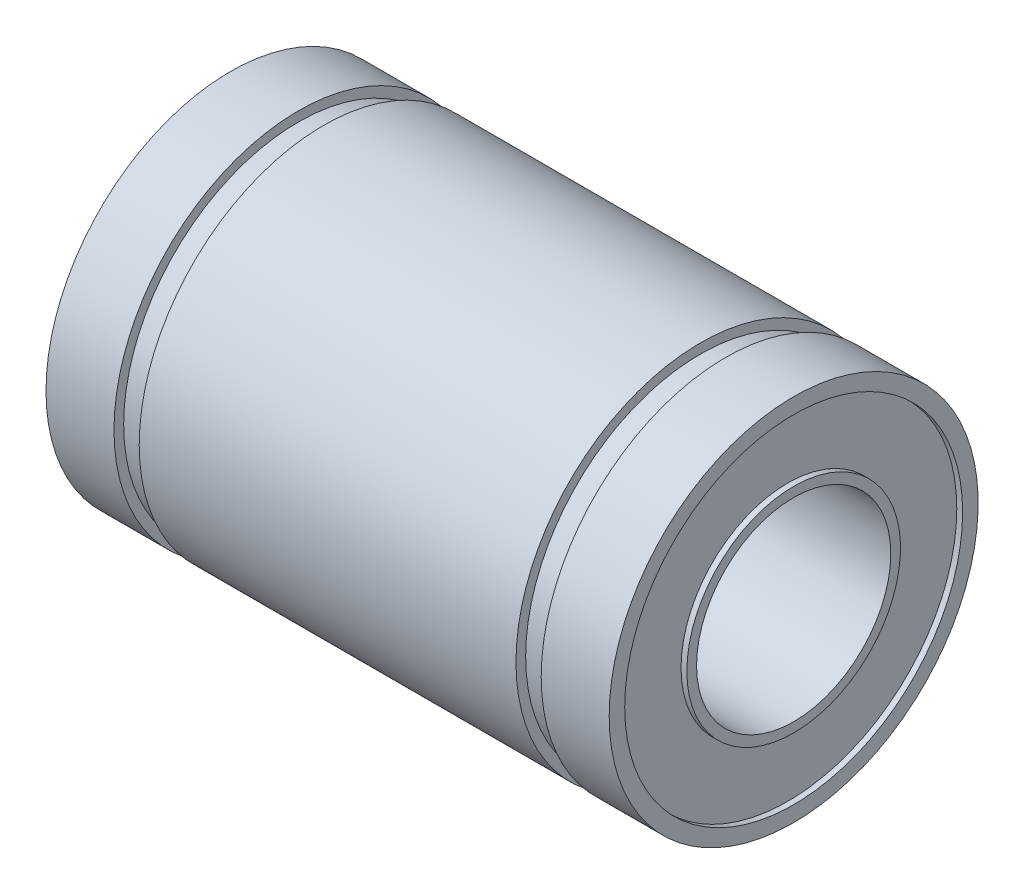
ISO-10303-21;
HEADER;
FILE_DESCRIPTION(('STEP AP214'),'2;1');
FILE_NAME('part.step','',(''),(''),'','','');
FILE_SCHEMA(('AUTOMOTIVE_DESIGN { 1 0 10303 214 1 1 1 1 }'));
ENDSEC;
DATA;
#1=APPLICATION_CONTEXT('core data for automotive mechanical design processes');
#2=APPLICATION_PROTOCOL_DEFINITION('international standard','automotive_design',2000,#1);
#3=PRODUCT_CONTEXT('',#1,'mechanical');
#4=PRODUCT('Part','Part','',(#3));
#5=PRODUCT_RELATED_PRODUCT_CATEGORY('part','',(#4));
#6=PRODUCT_DEFINITION_FORMATION('','',#4);
#7=PRODUCT_DEFINITION_CONTEXT('part definition',#1,'design');
#8=PRODUCT_DEFINITION('design','',#6,#7);
#9=PRODUCT_DEFINITION_SHAPE('','',#8);
#10=(LENGTH_UNIT() NAMED_UNIT(*) SI_UNIT(.MILLI.,.METRE.));
#11=(NAMED_UNIT(*) PLANE_ANGLE_UNIT() SI_UNIT($,.RADIAN.));
#12=(NAMED_UNIT(*) SI_UNIT($,.STERADIAN.) SOLID_ANGLE_UNIT());
#13=UNCERTAINTY_MEASURE_WITH_UNIT(LENGTH_MEASURE(1.E-05),#10,'distance_accuracy_value','');
#14=(GEOMETRIC_REPRESENTATION_CONTEXT(3) GLOBAL_UNCERTAINTY_ASSIGNED_CONTEXT((#13)) GLOBAL_UNIT_ASSIGNED_CONTEXT((#10,
#11,#12)) REPRESENTATION_CONTEXT('',''));
#15=CARTESIAN_POINT('',(0.,0.,0.));
#16=DIRECTION('',(0.,0.,1.));
#17=DIRECTION('',(1.,0.,0.));
#18=AXIS2_PLACEMENT_3D('',#15,#16,#17);
#19=CARTESIAN_POINT('',(-14.5,5.,0.));
#20=DIRECTION('',(1.,0.,0.));
#21=DIRECTION('',(0.,0.,-1.));
#22=AXIS2_PLACEMENT_3D('',#19,#20,#21);
#23=PLANE('',#22);
#24=CARTESIAN_POINT('',(-14.5,0.,0.));
#25=DIRECTION('',(-1.,0.,0.));
#26=DIRECTION('',(0.,0.,1.));
#27=AXIS2_PLACEMENT_3D('',#24,#25,#26);
#28=CIRCLE('',#27,5.);
#29=CARTESIAN_POINT('',(-14.5,0.,5.));
#30=VERTEX_POINT('',#29);
#31=EDGE_CURVE('E97',#30,#30,#28,.T.);
#32=ORIENTED_EDGE('',*,*,#31,.F.);
#33=EDGE_LOOP('',(#32));
#34=FACE_BOUND('',#33,.T.);
#35=CARTESIAN_POINT('',(-14.5,0.,0.));
#36=DIRECTION('',(-1.,0.,0.));
#37=DIRECTION('',(0.,0.,1.));
#38=AXIS2_PLACEMENT_3D('',#35,#36,#37);
#39=CIRCLE('',#38,5.5);
#40=CARTESIAN_POINT('',(-14.5,0.,5.5));
#41=VERTEX_POINT('',#40);
#42=EDGE_CURVE('E10',#41,#41,#39,.T.);
#43=ORIENTED_EDGE('',*,*,#42,.T.);
#44=EDGE_LOOP('',(#43));
#45=FACE_BOUND('',#44,.T.);
#46=ADVANCED_FACE('F33',(#34,#45),#23,.F.);
#47=CARTESIAN_POINT('',(-14.5,0.,0.));
#48=DIRECTION('',(-1.,0.,0.));
#49=DIRECTION('',(0.,0.,1.));
#50=AXIS2_PLACEMENT_3D('',#47,#48,#49);
#51=CYLINDRICAL_SURFACE('',#50,5.5);
#52=ORIENTED_EDGE('',*,*,#42,.F.);
#53=EDGE_LOOP('',(#52));
#54=FACE_BOUND('',#53,.T.);
#55=CARTESIAN_POINT('',(-14.2,0.,0.));
#56=DIRECTION('',(-1.,0.,0.));
#57=DIRECTION('',(0.,0.,1.));
#58=AXIS2_PLACEMENT_3D('',#55,#56,#57);
#59=CIRCLE('',#58,5.5);
#60=CARTESIAN_POINT('',(-14.2,0.,5.5));
#61=VERTEX_POINT('',#60);
#62=EDGE_CURVE('E39',#61,#61,#59,.T.);
#63=ORIENTED_EDGE('',*,*,#62,.T.);
#64=EDGE_LOOP('',(#63));
#65=FACE_BOUND('',#64,.T.);
#66=ADVANCED_FACE('F104',(#54,#65),#51,.T.);
#67=CARTESIAN_POINT('',(-14.2,8.7,0.));
#68=DIRECTION('',(1.,0.,0.));
#69=DIRECTION('',(0.,0.,-1.));
#70=AXIS2_PLACEMENT_3D('',#67,#68,#69);
#71=PLANE('',#70);
#72=ORIENTED_EDGE('',*,*,#62,.F.);
#73=EDGE_LOOP('',(#72));
#74=FACE_BOUND('',#73,.T.);
#75=CARTESIAN_POINT('',(-14.2,0.,0.));
#76=DIRECTION('',(-1.,0.,0.));
#77=DIRECTION('',(0.,0.,1.));
#78=AXIS2_PLACEMENT_3D('',#75,#76,#77);
#79=CIRCLE('',#78,8.7);
#80=CARTESIAN_POINT('',(-14.2,0.,8.7));
#81=VERTEX_POINT('',#80);
#82=EDGE_CURVE('E43',#81,#81,#79,.T.);
#83=ORIENTED_EDGE('',*,*,#82,.T.);
#84=EDGE_LOOP('',(#83));
#85=FACE_BOUND('',#84,.T.);
#86=ADVANCED_FACE('F108',(#74,#85),#71,.F.);
#87=CARTESIAN_POINT('',(-14.5,0.,0.));
#88=DIRECTION('',(-1.,0.,0.));
#89=DIRECTION('',(0.,0.,1.));
#90=AXIS2_PLACEMENT_3D('',#87,#88,#89);
#91=CYLINDRICAL_SURFACE('',#90,8.7);
#92=ORIENTED_EDGE('',*,*,#82,.F.);
#93=EDGE_LOOP('',(#92));
#94=FACE_BOUND('',#93,.T.);
#95=CARTESIAN_POINT('',(-14.5,0.,0.));
#96=DIRECTION('',(-1.,0.,0.));
#97=DIRECTION('',(0.,0.,1.));
#98=AXIS2_PLACEMENT_3D('',#95,#96,#97);
#99=CIRCLE('',#98,8.7);
#100=CARTESIAN_POINT('',(-14.5,0.,8.7));
#101=VERTEX_POINT('',#100);
#102=EDGE_CURVE('E47',#101,#101,#99,.T.);
#103=ORIENTED_EDGE('',*,*,#102,.T.);
#104=EDGE_LOOP('',(#103));
#105=FACE_BOUND('',#104,.T.);
#106=ADVANCED_FACE('F113',(#94,#105),#91,.F.);
#107=CARTESIAN_POINT('',(-14.5,8.7,0.));
#108=DIRECTION('',(1.,0.,0.));
#109=DIRECTION('',(0.,0.,-1.));
#110=AXIS2_PLACEMENT_3D('',#107,#108,#109);
#111=PLANE('',#110);
#112=ORIENTED_EDGE('',*,*,#102,.F.);
#113=EDGE_LOOP('',(#112));
#114=FACE_BOUND('',#113,.T.);
#115=CARTESIAN_POINT('',(-14.5,0.,0.));
#116=DIRECTION('',(-1.,0.,0.));
#117=DIRECTION('',(0.,0.,1.));
#118=AXIS2_PLACEMENT_3D('',#115,#116,#117);
#119=CIRCLE('',#118,9.5);
#120=CARTESIAN_POINT('',(-14.5,0.,9.5));
#121=VERTEX_POINT('',#120);
#122=EDGE_CURVE('E52',#121,#121,#119,.T.);
#123=ORIENTED_EDGE('',*,*,#122,.T.);
#124=EDGE_LOOP('',(#123));
#125=FACE_BOUND('',#124,.T.);
#126=ADVANCED_FACE('F119',(#114,#125),#111,.F.);
#127=CARTESIAN_POINT('',(-14.5,0.,0.));
#128=DIRECTION('',(-1.,0.,0.));
#129=DIRECTION('',(0.,0.,1.));
#130=AXIS2_PLACEMENT_3D('',#127,#128,#129);
#131=CYLINDRICAL_SURFACE('',#130,9.5);
#132=ORIENTED_EDGE('',*,*,#122,.F.);
#133=EDGE_LOOP('',(#132));
#134=FACE_BOUND('',#133,.T.);
#135=CARTESIAN_POINT('',(-11.,0.,0.));
#136=DIRECTION('',(-1.,0.,0.));
#137=DIRECTION('',(0.,0.,1.));
#138=AXIS2_PLACEMENT_3D('',#135,#136,#137);
#139=CIRCLE('',#138,9.5);
#140=CARTESIAN_POINT('',(-11.,0.,9.5));
#141=VERTEX_POINT('',#140);
#142=EDGE_CURVE('E55',#141,#141,#139,.T.);
#143=ORIENTED_EDGE('',*,*,#142,.T.);
#144=EDGE_LOOP('',(#143));
#145=FACE_BOUND('',#144,.T.);
#146=ADVANCED_FACE('F123',(#134,#145),#131,.T.);
#147=CARTESIAN_POINT('',(-11.,9.5,0.));
#148=DIRECTION('',(-1.,0.,0.));
#149=DIRECTION('',(0.,0.,1.));
#150=AXIS2_PLACEMENT_3D('',#147,#148,#149);
#151=PLANE('',#150);
#152=ORIENTED_EDGE('',*,*,#142,.F.);
#153=EDGE_LOOP('',(#152));
#154=FACE_BOUND('',#153,.T.);
#155=CARTESIAN_POINT('',(-11.,0.,0.));
#156=DIRECTION('',(-1.,0.,0.));
#157=DIRECTION('',(0.,0.,1.));
#158=AXIS2_PLACEMENT_3D('',#155,#156,#157);
#159=CIRCLE('',#158,9.);
#160=CARTESIAN_POINT('',(-11.,0.,9.));
#161=VERTEX_POINT('',#160);
#162=EDGE_CURVE('E58',#161,#161,#159,.T.);
#163=ORIENTED_EDGE('',*,*,#162,.T.);
#164=EDGE_LOOP('',(#163));
#165=FACE_BOUND('',#164,.T.);
#166=ADVANCED_FACE('F127',(#154,#165),#151,.F.);
#167=CARTESIAN_POINT('',(-14.5,0.,0.));
#168=DIRECTION('',(-1.,0.,0.));
#169=DIRECTION('',(0.,0.,1.));
#170=AXIS2_PLACEMENT_3D('',#167,#168,#169);
#171=CYLINDRICAL_SURFACE('',#170,9.);
#172=ORIENTED_EDGE('',*,*,#162,.F.);
#173=EDGE_LOOP('',(#172));
#174=FACE_BOUND('',#173,.T.);
#175=CARTESIAN_POINT('',(-9.7,0.,0.));
#176=DIRECTION('',(-1.,0.,0.));
#177=DIRECTION('',(0.,0.,1.));
#178=AXIS2_PLACEMENT_3D('',#175,#176,#177);
#179=CIRCLE('',#178,9.);
#180=CARTESIAN_POINT('',(-9.7,0.,9.));
#181=VERTEX_POINT('',#180);
#182=EDGE_CURVE('E61',#181,#181,#179,.T.);
#183=ORIENTED_EDGE('',*,*,#182,.T.);
#184=EDGE_LOOP('',(#183));
#185=FACE_BOUND('',#184,.T.);
#186=ADVANCED_FACE('F131',(#174,#185),#171,.T.);
#187=CARTESIAN_POINT('',(-9.7,9.5,0.));
#188=DIRECTION('',(1.,0.,0.));
#189=DIRECTION('',(0.,0.,-1.));
#190=AXIS2_PLACEMENT_3D('',#187,#188,#189);
#191=PLANE('',#190);
#192=ORIENTED_EDGE('',*,*,#182,.F.);
#193=EDGE_LOOP('',(#192));
#194=FACE_BOUND('',#193,.T.);
#195=CARTESIAN_POINT('',(-9.7,0.,0.));
#196=DIRECTION('',(-1.,0.,0.));
#197=DIRECTION('',(0.,0.,1.));
#198=AXIS2_PLACEMENT_3D('',#195,#196,#197);
#199=CIRCLE('',#198,9.5);
#200=CARTESIAN_POINT('',(-9.7,0.,9.5));
#201=VERTEX_POINT('',#200);
#202=EDGE_CURVE('E64',#201,#201,#199,.T.);
#203=ORIENTED_EDGE('',*,*,#202,.T.);
#204=EDGE_LOOP('',(#203));
#205=FACE_BOUND('',#204,.T.);
#206=ADVANCED_FACE('F135',(#194,#205),#191,.F.);
#207=CARTESIAN_POINT('',(-14.5,0.,0.));
#208=DIRECTION('',(-1.,0.,0.));
#209=DIRECTION('',(0.,0.,1.));
#210=AXIS2_PLACEMENT_3D('',#207,#208,#209);
#211=CYLINDRICAL_SURFACE('',#210,9.5);
#212=ORIENTED_EDGE('',*,*,#202,.F.);
#213=EDGE_LOOP('',(#212));
#214=FACE_BOUND('',#213,.T.);
#215=CARTESIAN_POINT('',(9.7,0.,0.));
#216=DIRECTION('',(-1.,0.,0.));
#217=DIRECTION('',(0.,0.,1.));
#218=AXIS2_PLACEMENT_3D('',#215,#216,#217);
#219=CIRCLE('',#218,9.5);
#220=CARTESIAN_POINT('',(9.7,0.,9.5));
#221=VERTEX_POINT('',#220);
#222=EDGE_CURVE('E67',#221,#221,#219,.T.);
#223=ORIENTED_EDGE('',*,*,#222,.T.);
#224=EDGE_LOOP('',(#223));
#225=FACE_BOUND('',#224,.T.);
#226=ADVANCED_FACE('F139',(#214,#225),#211,.T.);
#227=CARTESIAN_POINT('',(9.7,9.5,0.));
#228=DIRECTION('',(-1.,0.,0.));
#229=DIRECTION('',(0.,0.,1.));
#230=AXIS2_PLACEMENT_3D('',#227,#228,#229);
#231=PLANE('',#230);
#232=ORIENTED_EDGE('',*,*,#222,.F.);
#233=EDGE_LOOP('',(#232));
#234=FACE_BOUND('',#233,.T.);
#235=CARTESIAN_POINT('',(9.7,0.,0.));
#236=DIRECTION('',(-1.,0.,0.));
#237=DIRECTION('',(0.,0.,1.));
#238=AXIS2_PLACEMENT_3D('',#235,#236,#237);
#239=CIRCLE('',#238,9.);
#240=CARTESIAN_POINT('',(9.7,0.,9.));
#241=VERTEX_POINT('',#240);
#242=EDGE_CURVE('E70',#241,#241,#239,.T.);
#243=ORIENTED_EDGE('',*,*,#242,.T.);
#244=EDGE_LOOP('',(#243));
#245=FACE_BOUND('',#244,.T.);
#246=ADVANCED_FACE('F143',(#234,#245),#231,.F.);
#247=CARTESIAN_POINT('',(-14.5,0.,0.));
#248=DIRECTION('',(-1.,0.,0.));
#249=DIRECTION('',(0.,0.,1.));
#250=AXIS2_PLACEMENT_3D('',#247,#248,#249);
#251=CYLINDRICAL_SURFACE('',#250,9.);
#252=ORIENTED_EDGE('',*,*,#242,.F.);
#253=EDGE_LOOP('',(#252));
#254=FACE_BOUND('',#253,.T.);
#255=CARTESIAN_POINT('',(11.,0.,0.));
#256=DIRECTION('',(-1.,0.,0.));
#257=DIRECTION('',(0.,0.,1.));
#258=AXIS2_PLACEMENT_3D('',#255,#256,#257);
#259=CIRCLE('',#258,9.);
#260=CARTESIAN_POINT('',(11.,0.,9.));
#261=VERTEX_POINT('',#260);
#262=EDGE_CURVE('E73',#261,#261,#259,.T.);
#263=ORIENTED_EDGE('',*,*,#262,.T.);
#264=EDGE_LOOP('',(#263));
#265=FACE_BOUND('',#264,.T.);
#266=ADVANCED_FACE('F147',(#254,#265),#251,.T.);
#267=CARTESIAN_POINT('',(11.,9.5,0.));
#268=DIRECTION('',(1.,0.,0.));
#269=DIRECTION('',(0.,0.,-1.));
#270=AXIS2_PLACEMENT_3D('',#267,#268,#269);
#271=PLANE('',#270);
#272=ORIENTED_EDGE('',*,*,#262,.F.);
#273=EDGE_LOOP('',(#272));
#274=FACE_BOUND('',#273,.T.);
#275=CARTESIAN_POINT('',(11.,0.,0.));
#276=DIRECTION('',(-1.,0.,0.));
#277=DIRECTION('',(0.,0.,1.));
#278=AXIS2_PLACEMENT_3D('',#275,#276,#277);
#279=CIRCLE('',#278,9.5);
#280=CARTESIAN_POINT('',(11.,0.,9.5));
#281=VERTEX_POINT('',#280);
#282=EDGE_CURVE('E76',#281,#281,#279,.T.);
#283=ORIENTED_EDGE('',*,*,#282,.T.);
#284=EDGE_LOOP('',(#283));
#285=FACE_BOUND('',#284,.T.);
#286=ADVANCED_FACE('F151',(#274,#285),#271,.F.);
#287=CARTESIAN_POINT('',(-14.5,0.,0.));
#288=DIRECTION('',(-1.,0.,0.));
#289=DIRECTION('',(0.,0.,1.));
#290=AXIS2_PLACEMENT_3D('',#287,#288,#289);
#291=CYLINDRICAL_SURFACE('',#290,9.5);
#292=ORIENTED_EDGE('',*,*,#282,.F.);
#293=EDGE_LOOP('',(#292));
#294=FACE_BOUND('',#293,.T.);
#295=CARTESIAN_POINT('',(14.5,0.,0.));
#296=DIRECTION('',(-1.,0.,0.));
#297=DIRECTION('',(0.,0.,1.));
#298=AXIS2_PLACEMENT_3D('',#295,#296,#297);
#299=CIRCLE('',#298,9.5);
#300=CARTESIAN_POINT('',(14.5,0.,9.5));
#301=VERTEX_POINT('',#300);
#302=EDGE_CURVE('E79',#301,#301,#299,.T.);
#303=ORIENTED_EDGE('',*,*,#302,.T.);
#304=EDGE_LOOP('',(#303));
#305=FACE_BOUND('',#304,.T.);
#306=ADVANCED_FACE('F155',(#294,#305),#291,.T.);
#307=CARTESIAN_POINT('',(14.5,8.7,0.));
#308=DIRECTION('',(-1.,0.,0.));
#309=DIRECTION('',(0.,0.,1.));
#310=AXIS2_PLACEMENT_3D('',#307,#308,#309);
#311=PLANE('',#310);
#312=ORIENTED_EDGE('',*,*,#302,.F.);
#313=EDGE_LOOP('',(#312));
#314=FACE_BOUND('',#313,.T.);
#315=CARTESIAN_POINT('',(14.5,0.,0.));
#316=DIRECTION('',(-1.,0.,0.));
#317=DIRECTION('',(0.,0.,1.));
#318=AXIS2_PLACEMENT_3D('',#315,#316,#317);
#319=CIRCLE('',#318,8.7);
#320=CARTESIAN_POINT('',(14.5,0.,8.7));
#321=VERTEX_POINT('',#320);
#322=EDGE_CURVE('E82',#321,#321,#319,.T.);
#323=ORIENTED_EDGE('',*,*,#322,.T.);
#324=EDGE_LOOP('',(#323));
#325=FACE_BOUND('',#324,.T.);
#326=ADVANCED_FACE('F159',(#314,#325),#311,.F.);
#327=CARTESIAN_POINT('',(-14.5,0.,0.));
#328=DIRECTION('',(-1.,0.,0.));
#329=DIRECTION('',(0.,0.,1.));
#330=AXIS2_PLACEMENT_3D('',#327,#328,#329);
#331=CYLINDRICAL_SURFACE('',#330,8.7);
#332=ORIENTED_EDGE('',*,*,#322,.F.);
#333=EDGE_LOOP('',(#332));
#334=FACE_BOUND('',#333,.T.);
#335=CARTESIAN_POINT('',(14.2,0.,0.));
#336=DIRECTION('',(-1.,0.,0.));
#337=DIRECTION('',(0.,0.,1.));
#338=AXIS2_PLACEMENT_3D('',#335,#336,#337);
#339=CIRCLE('',#338,8.7);
#340=CARTESIAN_POINT('',(14.2,0.,8.7));
#341=VERTEX_POINT('',#340);
#342=EDGE_CURVE('E85',#341,#341,#339,.T.);
#343=ORIENTED_EDGE('',*,*,#342,.T.);
#344=EDGE_LOOP('',(#343));
#345=FACE_BOUND('',#344,.T.);
#346=ADVANCED_FACE('F163',(#334,#345),#331,.F.);
#347=CARTESIAN_POINT('',(14.2,8.7,0.));
#348=DIRECTION('',(-1.,0.,0.));
#349=DIRECTION('',(0.,0.,1.));
#350=AXIS2_PLACEMENT_3D('',#347,#348,#349);
#351=PLANE('',#350);
#352=ORIENTED_EDGE('',*,*,#342,.F.);
#353=EDGE_LOOP('',(#352));
#354=FACE_BOUND('',#353,.T.);
#355=CARTESIAN_POINT('',(14.2,0.,0.));
#356=DIRECTION('',(-1.,0.,0.));
#357=DIRECTION('',(0.,0.,1.));
#358=AXIS2_PLACEMENT_3D('',#355,#356,#357);
#359=CIRCLE('',#358,5.5);
#360=CARTESIAN_POINT('',(14.2,0.,5.5));
#361=VERTEX_POINT('',#360);
#362=EDGE_CURVE('E88',#361,#361,#359,.T.);
#363=ORIENTED_EDGE('',*,*,#362,.T.);
#364=EDGE_LOOP('',(#363));
#365=FACE_BOUND('',#364,.T.);
#366=ADVANCED_FACE('F167',(#354,#365),#351,.F.);
#367=CARTESIAN_POINT('',(-14.5,0.,0.));
#368=DIRECTION('',(-1.,0.,0.));
#369=DIRECTION('',(0.,0.,1.));
#370=AXIS2_PLACEMENT_3D('',#367,#368,#369);
#371=CYLINDRICAL_SURFACE('',#370,5.5);
#372=ORIENTED_EDGE('',*,*,#362,.F.);
#373=EDGE_LOOP('',(#372));
#374=FACE_BOUND('',#373,.T.);
#375=CARTESIAN_POINT('',(14.5,0.,0.));
#376=DIRECTION('',(-1.,0.,0.));
#377=DIRECTION('',(0.,0.,1.));
#378=AXIS2_PLACEMENT_3D('',#375,#376,#377);
#379=CIRCLE('',#378,5.5);
#380=CARTESIAN_POINT('',(14.5,0.,5.5));
#381=VERTEX_POINT('',#380);
#382=EDGE_CURVE('E91',#381,#381,#379,.T.);
#383=ORIENTED_EDGE('',*,*,#382,.T.);
#384=EDGE_LOOP('',(#383));
#385=FACE_BOUND('',#384,.T.);
#386=ADVANCED_FACE('F171',(#374,#385),#371,.T.);
#387=CARTESIAN_POINT('',(14.5,5.,0.));
#388=DIRECTION('',(-1.,0.,0.));
#389=DIRECTION('',(0.,0.,1.));
#390=AXIS2_PLACEMENT_3D('',#387,#388,#389);
#391=PLANE('',#390);
#392=ORIENTED_EDGE('',*,*,#382,.F.);
#393=EDGE_LOOP('',(#392));
#394=FACE_BOUND('',#393,.T.);
#395=CARTESIAN_POINT('',(14.5,0.,0.));
#396=DIRECTION('',(-1.,0.,0.));
#397=DIRECTION('',(0.,0.,1.));
#398=AXIS2_PLACEMENT_3D('',#395,#396,#397);
#399=CIRCLE('',#398,5.);
#400=CARTESIAN_POINT('',(14.5,0.,5.));
#401=VERTEX_POINT('',#400);
#402=EDGE_CURVE('E94',#401,#401,#399,.T.);
#403=ORIENTED_EDGE('',*,*,#402,.T.);
#404=EDGE_LOOP('',(#403));
#405=FACE_BOUND('',#404,.T.);
#406=ADVANCED_FACE('F175',(#394,#405),#391,.F.);
#407=CARTESIAN_POINT('',(-14.5,0.,0.));
#408=DIRECTION('',(-1.,0.,0.));
#409=DIRECTION('',(0.,0.,1.));
#410=AXIS2_PLACEMENT_3D('',#407,#408,#409);
#411=CYLINDRICAL_SURFACE('',#410,5.);
#412=ORIENTED_EDGE('',*,*,#402,.F.);
#413=EDGE_LOOP('',(#412));
#414=FACE_BOUND('',#413,.T.);
#415=ORIENTED_EDGE('',*,*,#31,.T.);
#416=EDGE_LOOP('',(#415));
#417=FACE_BOUND('',#416,.T.);
#418=ADVANCED_FACE('F101',(#414,#417),#411,.F.);
#419=CLOSED_SHELL('',(#46,#66,#86,#106,#126,#146,#166,#186,#206,#226,#246,#266,#286,#306,#326,
#346,#366,#386,#406,#418));
#420=MANIFOLD_SOLID_BREP('B2',#419);
#421=ADVANCED_BREP_SHAPE_REPRESENTATION('',(#18,#420),#14);
#422=SHAPE_DEFINITION_REPRESENTATION(#9,#421);
ENDSEC;
END-ISO-10303-21;
